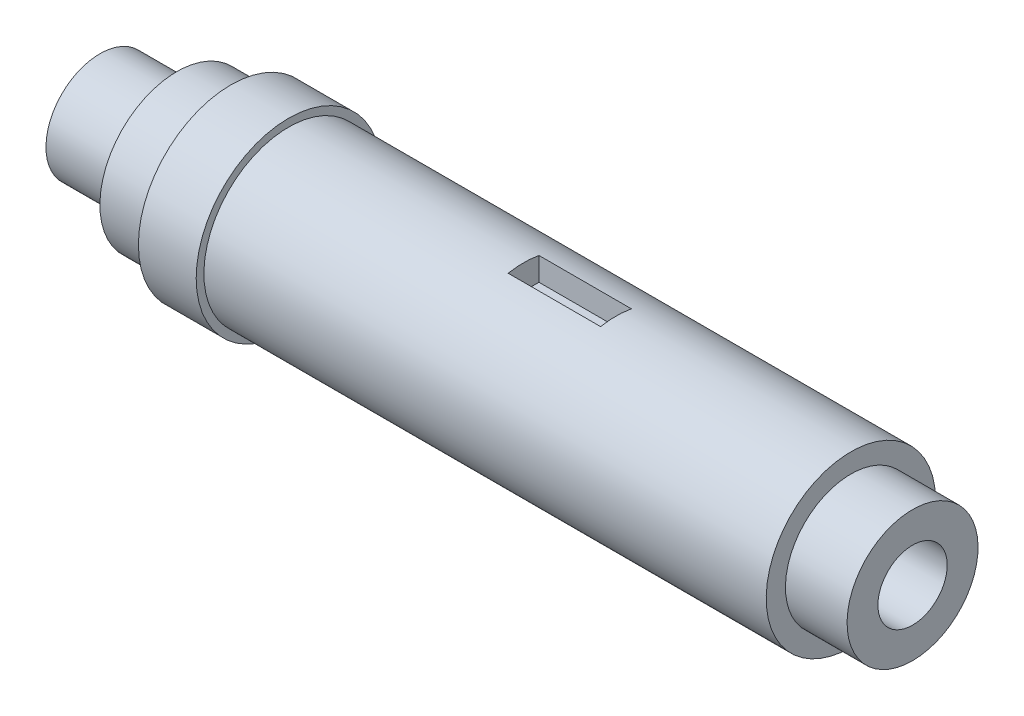
ISO-10303-21;
HEADER;
FILE_DESCRIPTION(('STEP AP214'),'2;1');
FILE_NAME('part.step','',(''),(''),'','','');
FILE_SCHEMA(('AUTOMOTIVE_DESIGN { 1 0 10303 214 1 1 1 1 }'));
ENDSEC;
DATA;
#1=APPLICATION_CONTEXT('core data for automotive mechanical design processes');
#2=APPLICATION_PROTOCOL_DEFINITION('international standard','automotive_design',2000,#1);
#3=PRODUCT_CONTEXT('',#1,'mechanical');
#4=PRODUCT('Part','Part','',(#3));
#5=PRODUCT_RELATED_PRODUCT_CATEGORY('part','',(#4));
#6=PRODUCT_DEFINITION_FORMATION('','',#4);
#7=PRODUCT_DEFINITION_CONTEXT('part definition',#1,'design');
#8=PRODUCT_DEFINITION('design','',#6,#7);
#9=PRODUCT_DEFINITION_SHAPE('','',#8);
#10=(LENGTH_UNIT() NAMED_UNIT(*) SI_UNIT(.MILLI.,.METRE.));
#11=(NAMED_UNIT(*) PLANE_ANGLE_UNIT() SI_UNIT($,.RADIAN.));
#12=(NAMED_UNIT(*) SI_UNIT($,.STERADIAN.) SOLID_ANGLE_UNIT());
#13=UNCERTAINTY_MEASURE_WITH_UNIT(LENGTH_MEASURE(1.E-05),#10,'distance_accuracy_value','');
#14=(GEOMETRIC_REPRESENTATION_CONTEXT(3) GLOBAL_UNCERTAINTY_ASSIGNED_CONTEXT((#13)) GLOBAL_UNIT_ASSIGNED_CONTEXT((#10,
#11,#12)) REPRESENTATION_CONTEXT('',''));
#15=CARTESIAN_POINT('',(0.,0.,0.));
#16=DIRECTION('',(0.,0.,1.));
#17=DIRECTION('',(1.,0.,0.));
#18=AXIS2_PLACEMENT_3D('',#15,#16,#17);
#19=CARTESIAN_POINT('',(-52.75,0.,0.));
#20=DIRECTION('',(-1.,0.,0.));
#21=DIRECTION('',(0.,-1.,0.));
#22=AXIS2_PLACEMENT_3D('',#19,#20,#21);
#23=CYLINDRICAL_SURFACE('',#22,4.49999999999999);
#24=CARTESIAN_POINT('',(52.75,0.,0.));
#25=DIRECTION('',(-1.,0.,0.));
#26=DIRECTION('',(0.,-1.,0.));
#27=AXIS2_PLACEMENT_3D('',#24,#25,#26);
#28=CIRCLE('',#27,4.49999999999999);
#29=CARTESIAN_POINT('',(52.75,-4.49999999999997,0.));
#30=VERTEX_POINT('',#29);
#31=EDGE_CURVE('E116',#30,#30,#28,.T.);
#32=ORIENTED_EDGE('',*,*,#31,.F.);
#33=EDGE_LOOP('',(#32));
#34=FACE_BOUND('',#33,.T.);
#35=CARTESIAN_POINT('',(-52.75,0.,0.));
#36=DIRECTION('',(-1.,0.,0.));
#37=DIRECTION('',(0.,-1.,0.));
#38=AXIS2_PLACEMENT_3D('',#35,#36,#37);
#39=CIRCLE('',#38,4.49999999999999);
#40=CARTESIAN_POINT('',(-52.75,-4.49999999999999,0.));
#41=VERTEX_POINT('',#40);
#42=EDGE_CURVE('E166',#41,#41,#39,.T.);
#43=ORIENTED_EDGE('',*,*,#42,.T.);
#44=EDGE_LOOP('',(#43));
#45=FACE_BOUND('',#44,.T.);
#46=ADVANCED_FACE('F45',(#34,#45),#23,.F.);
#47=CARTESIAN_POINT('',(-52.75,4.49999999999999,0.));
#48=DIRECTION('',(1.,0.,0.));
#49=DIRECTION('',(0.,1.,0.));
#50=AXIS2_PLACEMENT_3D('',#47,#48,#49);
#51=PLANE('',#50);
#52=ORIENTED_EDGE('',*,*,#42,.F.);
#53=EDGE_LOOP('',(#52));
#54=FACE_BOUND('',#53,.T.);
#55=CARTESIAN_POINT('',(-52.75,0.,0.));
#56=DIRECTION('',(-1.,0.,0.));
#57=DIRECTION('',(0.,-1.,0.));
#58=AXIS2_PLACEMENT_3D('',#55,#56,#57);
#59=CIRCLE('',#58,7.);
#60=CARTESIAN_POINT('',(-52.75,-7.,0.));
#61=VERTEX_POINT('',#60);
#62=EDGE_CURVE('E162',#61,#61,#59,.T.);
#63=ORIENTED_EDGE('',*,*,#62,.T.);
#64=EDGE_LOOP('',(#63));
#65=FACE_BOUND('',#64,.T.);
#66=ADVANCED_FACE('F193',(#54,#65),#51,.F.);
#67=CARTESIAN_POINT('',(-52.75,0.,0.));
#68=DIRECTION('',(-1.,0.,0.));
#69=DIRECTION('',(0.,-1.,0.));
#70=AXIS2_PLACEMENT_3D('',#67,#68,#69);
#71=CYLINDRICAL_SURFACE('',#70,7.);
#72=ORIENTED_EDGE('',*,*,#62,.F.);
#73=EDGE_LOOP('',(#72));
#74=FACE_BOUND('',#73,.T.);
#75=CARTESIAN_POINT('',(-42.75,0.,0.));
#76=DIRECTION('',(-1.,0.,0.));
#77=DIRECTION('',(0.,-1.,0.));
#78=AXIS2_PLACEMENT_3D('',#75,#76,#77);
#79=CIRCLE('',#78,7.);
#80=CARTESIAN_POINT('',(-42.75,-7.,0.));
#81=VERTEX_POINT('',#80);
#82=EDGE_CURVE('E158',#81,#81,#79,.T.);
#83=ORIENTED_EDGE('',*,*,#82,.T.);
#84=EDGE_LOOP('',(#83));
#85=FACE_BOUND('',#84,.T.);
#86=ADVANCED_FACE('F198',(#74,#85),#71,.T.);
#87=CARTESIAN_POINT('',(-42.75,7.,0.));
#88=DIRECTION('',(1.,0.,0.));
#89=DIRECTION('',(0.,1.,0.));
#90=AXIS2_PLACEMENT_3D('',#87,#88,#89);
#91=PLANE('',#90);
#92=ORIENTED_EDGE('',*,*,#82,.F.);
#93=EDGE_LOOP('',(#92));
#94=FACE_BOUND('',#93,.T.);
#95=CARTESIAN_POINT('',(-42.75,0.,0.));
#96=DIRECTION('',(-1.,0.,0.));
#97=DIRECTION('',(0.,-1.,0.));
#98=AXIS2_PLACEMENT_3D('',#95,#96,#97);
#99=CIRCLE('',#98,10.);
#100=CARTESIAN_POINT('',(-42.75,-10.,0.));
#101=VERTEX_POINT('',#100);
#102=EDGE_CURVE('E154',#101,#101,#99,.T.);
#103=ORIENTED_EDGE('',*,*,#102,.T.);
#104=EDGE_LOOP('',(#103));
#105=FACE_BOUND('',#104,.T.);
#106=ADVANCED_FACE('F208',(#94,#105),#91,.F.);
#107=CARTESIAN_POINT('',(-52.75,0.,0.));
#108=DIRECTION('',(-1.,0.,0.));
#109=DIRECTION('',(0.,-1.,0.));
#110=AXIS2_PLACEMENT_3D('',#107,#108,#109);
#111=CYLINDRICAL_SURFACE('',#110,10.);
#112=ORIENTED_EDGE('',*,*,#102,.F.);
#113=EDGE_LOOP('',(#112));
#114=FACE_BOUND('',#113,.T.);
#115=CARTESIAN_POINT('',(-35.75,0.,0.));
#116=DIRECTION('',(-1.,0.,0.));
#117=DIRECTION('',(0.,-1.,0.));
#118=AXIS2_PLACEMENT_3D('',#115,#116,#117);
#119=CIRCLE('',#118,10.);
#120=CARTESIAN_POINT('',(-35.75,-9.99999999999999,0.));
#121=VERTEX_POINT('',#120);
#122=EDGE_CURVE('E150',#121,#121,#119,.T.);
#123=ORIENTED_EDGE('',*,*,#122,.T.);
#124=EDGE_LOOP('',(#123));
#125=FACE_BOUND('',#124,.T.);
#126=ADVANCED_FACE('F214',(#114,#125),#111,.T.);
#127=CARTESIAN_POINT('',(-35.75,10.,0.));
#128=DIRECTION('',(1.,0.,0.));
#129=DIRECTION('',(0.,1.,0.));
#130=AXIS2_PLACEMENT_3D('',#127,#128,#129);
#131=PLANE('',#130);
#132=ORIENTED_EDGE('',*,*,#122,.F.);
#133=EDGE_LOOP('',(#132));
#134=FACE_BOUND('',#133,.T.);
#135=CARTESIAN_POINT('',(-35.75,0.,0.));
#136=DIRECTION('',(-1.,0.,0.));
#137=DIRECTION('',(0.,-1.,0.));
#138=AXIS2_PLACEMENT_3D('',#135,#136,#137);
#139=CIRCLE('',#138,12.);
#140=CARTESIAN_POINT('',(-35.75,-12.,0.));
#141=VERTEX_POINT('',#140);
#142=EDGE_CURVE('E146',#141,#141,#139,.T.);
#143=ORIENTED_EDGE('',*,*,#142,.T.);
#144=EDGE_LOOP('',(#143));
#145=FACE_BOUND('',#144,.T.);
#146=ADVANCED_FACE('F220',(#134,#145),#131,.F.);
#147=CARTESIAN_POINT('',(-52.75,0.,0.));
#148=DIRECTION('',(-1.,0.,0.));
#149=DIRECTION('',(0.,-1.,0.));
#150=AXIS2_PLACEMENT_3D('',#147,#148,#149);
#151=CYLINDRICAL_SURFACE('',#150,12.);
#152=ORIENTED_EDGE('',*,*,#142,.F.);
#153=EDGE_LOOP('',(#152));
#154=FACE_BOUND('',#153,.T.);
#155=CARTESIAN_POINT('',(-28.25,0.,0.));
#156=DIRECTION('',(-1.,0.,0.));
#157=DIRECTION('',(0.,-1.,0.));
#158=AXIS2_PLACEMENT_3D('',#155,#156,#157);
#159=CIRCLE('',#158,12.);
#160=CARTESIAN_POINT('',(-28.25,-12.,0.));
#161=VERTEX_POINT('',#160);
#162=EDGE_CURVE('E142',#161,#161,#159,.T.);
#163=ORIENTED_EDGE('',*,*,#162,.T.);
#164=EDGE_LOOP('',(#163));
#165=FACE_BOUND('',#164,.T.);
#166=ADVANCED_FACE('F226',(#154,#165),#151,.T.);
#167=CARTESIAN_POINT('',(-28.25,12.,0.));
#168=DIRECTION('',(-1.,0.,0.));
#169=DIRECTION('',(0.,-1.,0.));
#170=AXIS2_PLACEMENT_3D('',#167,#168,#169);
#171=PLANE('',#170);
#172=ORIENTED_EDGE('',*,*,#162,.F.);
#173=EDGE_LOOP('',(#172));
#174=FACE_BOUND('',#173,.T.);
#175=CARTESIAN_POINT('',(-28.25,0.,0.));
#176=DIRECTION('',(-1.,0.,0.));
#177=DIRECTION('',(0.,-1.,0.));
#178=AXIS2_PLACEMENT_3D('',#175,#176,#177);
#179=CIRCLE('',#178,11.);
#180=CARTESIAN_POINT('',(-28.25,-11.,0.));
#181=VERTEX_POINT('',#180);
#182=EDGE_CURVE('E138',#181,#181,#179,.T.);
#183=ORIENTED_EDGE('',*,*,#182,.T.);
#184=EDGE_LOOP('',(#183));
#185=FACE_BOUND('',#184,.T.);
#186=ADVANCED_FACE('F232',(#174,#185),#171,.F.);
#187=CARTESIAN_POINT('',(-52.75,0.,0.));
#188=DIRECTION('',(-1.,0.,0.));
#189=DIRECTION('',(0.,-1.,0.));
#190=AXIS2_PLACEMENT_3D('',#187,#188,#189);
#191=CYLINDRICAL_SURFACE('',#190,11.);
#192=CARTESIAN_POINT('',(14.25,0.,0.));
#193=DIRECTION('',(1.,0.,0.));
#194=DIRECTION('',(0.,1.,0.));
#195=AXIS2_PLACEMENT_3D('',#192,#193,#194);
#196=CIRCLE('',#195,11.);
#197=CARTESIAN_POINT('',(14.25,10.816653826392,-2.));
#198=VERTEX_POINT('',#197);
#199=CARTESIAN_POINT('',(14.25,10.816653826392,2.));
#200=VERTEX_POINT('',#199);
#201=EDGE_CURVE('E66',#198,#200,#196,.T.);
#202=ORIENTED_EDGE('',*,*,#201,.T.);
#203=DIRECTION('',(-1.,0.,0.));
#204=VECTOR('',#203,1.);
#205=CARTESIAN_POINT('',(-52.75,10.816653826392,2.));
#206=LINE('',#205,#204);
#207=CARTESIAN_POINT('',(2.25,10.816653826392,2.));
#208=VERTEX_POINT('',#207);
#209=EDGE_CURVE('E11',#200,#208,#206,.T.);
#210=ORIENTED_EDGE('',*,*,#209,.T.);
#211=CARTESIAN_POINT('',(2.25,0.,0.));
#212=DIRECTION('',(-1.,0.,0.));
#213=DIRECTION('',(0.,-1.,0.));
#214=AXIS2_PLACEMENT_3D('',#211,#212,#213);
#215=CIRCLE('',#214,11.);
#216=CARTESIAN_POINT('',(2.25,10.816653826392,-2.));
#217=VERTEX_POINT('',#216);
#218=EDGE_CURVE('E170',#208,#217,#215,.T.);
#219=ORIENTED_EDGE('',*,*,#218,.T.);
#220=DIRECTION('',(-1.,0.,0.));
#221=VECTOR('',#220,1.);
#222=CARTESIAN_POINT('',(-52.75,10.816653826392,-2.));
#223=LINE('',#222,#221);
#224=EDGE_CURVE('E53',#217,#198,#223,.F.);
#225=ORIENTED_EDGE('',*,*,#224,.T.);
#226=EDGE_LOOP('',(#202,#210,#219,#225));
#227=FACE_BOUND('',#226,.T.);
#228=ORIENTED_EDGE('',*,*,#182,.F.);
#229=EDGE_LOOP('',(#228));
#230=FACE_BOUND('',#229,.T.);
#231=CARTESIAN_POINT('',(44.75,0.,0.));
#232=DIRECTION('',(-1.,0.,0.));
#233=DIRECTION('',(0.,-1.,0.));
#234=AXIS2_PLACEMENT_3D('',#231,#232,#233);
#235=CIRCLE('',#234,11.);
#236=CARTESIAN_POINT('',(44.75,-11.,0.));
#237=VERTEX_POINT('',#236);
#238=EDGE_CURVE('E134',#237,#237,#235,.T.);
#239=ORIENTED_EDGE('',*,*,#238,.T.);
#240=EDGE_LOOP('',(#239));
#241=FACE_BOUND('',#240,.T.);
#242=ADVANCED_FACE('F176',(#227,#230,#241),#191,.T.);
#243=CARTESIAN_POINT('',(44.75,11.,0.));
#244=DIRECTION('',(-1.,0.,0.));
#245=DIRECTION('',(0.,-1.,0.));
#246=AXIS2_PLACEMENT_3D('',#243,#244,#245);
#247=PLANE('',#246);
#248=ORIENTED_EDGE('',*,*,#238,.F.);
#249=EDGE_LOOP('',(#248));
#250=FACE_BOUND('',#249,.T.);
#251=CARTESIAN_POINT('',(44.75,0.,0.));
#252=DIRECTION('',(-1.,0.,0.));
#253=DIRECTION('',(0.,-1.,0.));
#254=AXIS2_PLACEMENT_3D('',#251,#252,#253);
#255=CIRCLE('',#254,8.49999999999998);
#256=CARTESIAN_POINT('',(44.75,-8.49999999999997,0.));
#257=VERTEX_POINT('',#256);
#258=EDGE_CURVE('E130',#257,#257,#255,.T.);
#259=ORIENTED_EDGE('',*,*,#258,.T.);
#260=EDGE_LOOP('',(#259));
#261=FACE_BOUND('',#260,.T.);
#262=ADVANCED_FACE('F242',(#250,#261),#247,.F.);
#263=CARTESIAN_POINT('',(-52.75,0.,0.));
#264=DIRECTION('',(-1.,0.,0.));
#265=DIRECTION('',(0.,-1.,0.));
#266=AXIS2_PLACEMENT_3D('',#263,#264,#265);
#267=CYLINDRICAL_SURFACE('',#266,8.49999999999998);
#268=ORIENTED_EDGE('',*,*,#258,.F.);
#269=EDGE_LOOP('',(#268));
#270=FACE_BOUND('',#269,.T.);
#271=CARTESIAN_POINT('',(52.75,0.,0.));
#272=DIRECTION('',(-1.,0.,0.));
#273=DIRECTION('',(0.,-1.,0.));
#274=AXIS2_PLACEMENT_3D('',#271,#272,#273);
#275=CIRCLE('',#274,8.49999999999998);
#276=CARTESIAN_POINT('',(52.75,-8.49999999999996,0.));
#277=VERTEX_POINT('',#276);
#278=EDGE_CURVE('E126',#277,#277,#275,.T.);
#279=ORIENTED_EDGE('',*,*,#278,.T.);
#280=EDGE_LOOP('',(#279));
#281=FACE_BOUND('',#280,.T.);
#282=ADVANCED_FACE('F248',(#270,#281),#267,.T.);
#283=CARTESIAN_POINT('',(52.75,8.5,0.));
#284=DIRECTION('',(-1.,0.,0.));
#285=DIRECTION('',(0.,-1.,0.));
#286=AXIS2_PLACEMENT_3D('',#283,#284,#285);
#287=PLANE('',#286);
#288=ORIENTED_EDGE('',*,*,#278,.F.);
#289=EDGE_LOOP('',(#288));
#290=FACE_BOUND('',#289,.T.);
#291=ORIENTED_EDGE('',*,*,#31,.T.);
#292=EDGE_LOOP('',(#291));
#293=FACE_BOUND('',#292,.T.);
#294=ADVANCED_FACE('F189',(#290,#293),#287,.F.);
#295=CARTESIAN_POINT('',(14.25,7.8,2.));
#296=DIRECTION('',(1.,0.,0.));
#297=DIRECTION('',(0.,1.,0.));
#298=AXIS2_PLACEMENT_3D('',#295,#296,#297);
#299=PLANE('',#298);
#300=ORIENTED_EDGE('',*,*,#201,.F.);
#301=DIRECTION('',(0.,1.,0.));
#302=VECTOR('',#301,1.);
#303=CARTESIAN_POINT('',(14.25,7.8,-2.));
#304=LINE('',#303,#302);
#305=CARTESIAN_POINT('',(14.25,7.8,-2.));
#306=VERTEX_POINT('',#305);
#307=EDGE_CURVE('E60',#306,#198,#304,.T.);
#308=ORIENTED_EDGE('',*,*,#307,.F.);
#309=DIRECTION('',(0.,0.,-1.));
#310=VECTOR('',#309,1.);
#311=CARTESIAN_POINT('',(14.25,7.8,2.));
#312=LINE('',#311,#310);
#313=CARTESIAN_POINT('',(14.25,7.8,2.));
#314=VERTEX_POINT('',#313);
#315=EDGE_CURVE('E88',#314,#306,#312,.T.);
#316=ORIENTED_EDGE('',*,*,#315,.F.);
#317=DIRECTION('',(0.,1.,0.));
#318=VECTOR('',#317,1.);
#319=CARTESIAN_POINT('',(14.25,7.8,2.));
#320=LINE('',#319,#318);
#321=EDGE_CURVE('E113',#314,#200,#320,.T.);
#322=ORIENTED_EDGE('',*,*,#321,.T.);
#323=EDGE_LOOP('',(#300,#308,#316,#322));
#324=FACE_BOUND('',#323,.T.);
#325=ADVANCED_FACE('F85',(#324),#299,.F.);
#326=CARTESIAN_POINT('',(2.25,7.8,2.));
#327=DIRECTION('',(0.,0.,1.));
#328=DIRECTION('',(1.,0.,0.));
#329=AXIS2_PLACEMENT_3D('',#326,#327,#328);
#330=PLANE('',#329);
#331=ORIENTED_EDGE('',*,*,#321,.F.);
#332=DIRECTION('',(1.,0.,0.));
#333=VECTOR('',#332,1.);
#334=CARTESIAN_POINT('',(2.25,7.8,2.));
#335=LINE('',#334,#333);
#336=CARTESIAN_POINT('',(2.25,7.8,2.));
#337=VERTEX_POINT('',#336);
#338=EDGE_CURVE('E92',#337,#314,#335,.T.);
#339=ORIENTED_EDGE('',*,*,#338,.F.);
#340=DIRECTION('',(0.,1.,0.));
#341=VECTOR('',#340,1.);
#342=CARTESIAN_POINT('',(2.25,7.8,2.));
#343=LINE('',#342,#341);
#344=EDGE_CURVE('E117',#337,#208,#343,.T.);
#345=ORIENTED_EDGE('',*,*,#344,.T.);
#346=ORIENTED_EDGE('',*,*,#209,.F.);
#347=EDGE_LOOP('',(#331,#339,#345,#346));
#348=FACE_BOUND('',#347,.T.);
#349=ADVANCED_FACE('F181',(#348),#330,.F.);
#350=CARTESIAN_POINT('',(2.25,7.8,2.));
#351=DIRECTION('',(-1.,0.,0.));
#352=DIRECTION('',(0.,-1.,0.));
#353=AXIS2_PLACEMENT_3D('',#350,#351,#352);
#354=PLANE('',#353);
#355=ORIENTED_EDGE('',*,*,#344,.F.);
#356=DIRECTION('',(0.,0.,1.));
#357=VECTOR('',#356,1.);
#358=CARTESIAN_POINT('',(2.25,7.8,2.));
#359=LINE('',#358,#357);
#360=CARTESIAN_POINT('',(2.25,7.8,-2.));
#361=VERTEX_POINT('',#360);
#362=EDGE_CURVE('E102',#361,#337,#359,.T.);
#363=ORIENTED_EDGE('',*,*,#362,.F.);
#364=DIRECTION('',(0.,1.,0.));
#365=VECTOR('',#364,1.);
#366=CARTESIAN_POINT('',(2.25,7.8,-2.));
#367=LINE('',#366,#365);
#368=EDGE_CURVE('E91',#361,#217,#367,.T.);
#369=ORIENTED_EDGE('',*,*,#368,.T.);
#370=ORIENTED_EDGE('',*,*,#218,.F.);
#371=EDGE_LOOP('',(#355,#363,#369,#370));
#372=FACE_BOUND('',#371,.T.);
#373=ADVANCED_FACE('F179',(#372),#354,.F.);
#374=CARTESIAN_POINT('',(2.25,7.8,-2.));
#375=DIRECTION('',(0.,0.,-1.));
#376=DIRECTION('',(-1.,0.,0.));
#377=AXIS2_PLACEMENT_3D('',#374,#375,#376);
#378=PLANE('',#377);
#379=ORIENTED_EDGE('',*,*,#368,.F.);
#380=DIRECTION('',(-1.,0.,0.));
#381=VECTOR('',#380,1.);
#382=CARTESIAN_POINT('',(2.25,7.8,-2.));
#383=LINE('',#382,#381);
#384=EDGE_CURVE('E95',#306,#361,#383,.T.);
#385=ORIENTED_EDGE('',*,*,#384,.F.);
#386=ORIENTED_EDGE('',*,*,#307,.T.);
#387=ORIENTED_EDGE('',*,*,#224,.F.);
#388=EDGE_LOOP('',(#379,#385,#386,#387));
#389=FACE_BOUND('',#388,.T.);
#390=ADVANCED_FACE('F96',(#389),#378,.F.);
#391=CARTESIAN_POINT('',(0.,7.8,0.));
#392=DIRECTION('',(0.,-1.,0.));
#393=DIRECTION('',(1.,0.,0.));
#394=AXIS2_PLACEMENT_3D('',#391,#392,#393);
#395=PLANE('',#394);
#396=ORIENTED_EDGE('',*,*,#315,.T.);
#397=ORIENTED_EDGE('',*,*,#384,.T.);
#398=ORIENTED_EDGE('',*,*,#362,.T.);
#399=ORIENTED_EDGE('',*,*,#338,.T.);
#400=EDGE_LOOP('',(#396,#397,#398,#399));
#401=FACE_BOUND('',#400,.T.);
#402=ADVANCED_FACE('F104',(#401),#395,.F.);
#403=CLOSED_SHELL('',(#46,#66,#86,#106,#126,#146,#166,#186,#242,#262,#282,#294,#325,#349,#373,
#390,#402));
#404=MANIFOLD_SOLID_BREP('B2',#403);
#405=ADVANCED_BREP_SHAPE_REPRESENTATION('',(#18,#404),#14);
#406=SHAPE_DEFINITION_REPRESENTATION(#9,#405);
ENDSEC;
END-ISO-10303-21;
